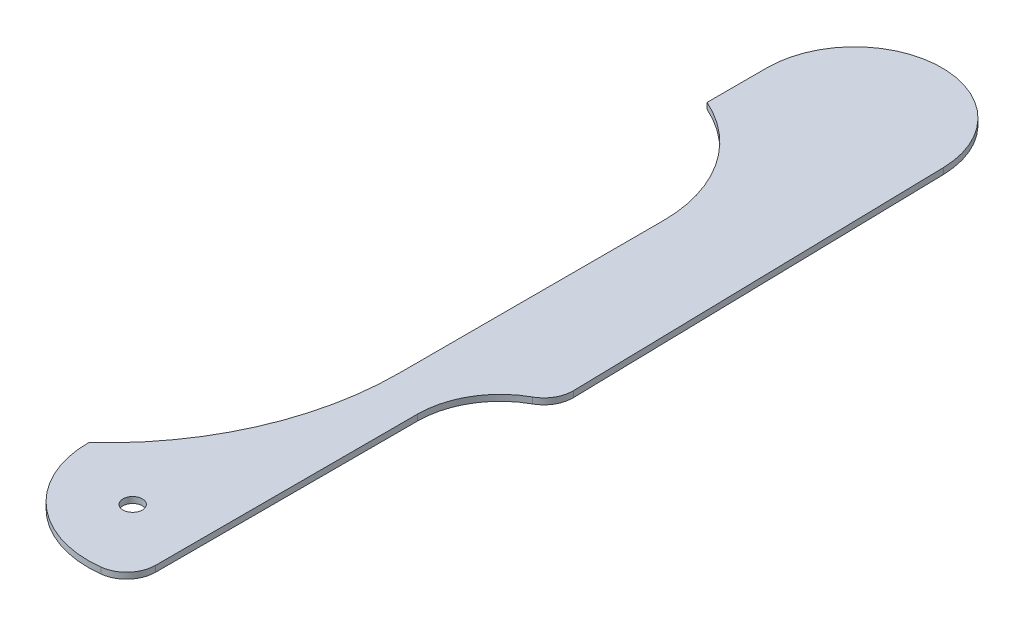
ISO-10303-21;
HEADER;
FILE_DESCRIPTION(('STEP AP214'),'2;1');
FILE_NAME('part.step','',(''),(''),'','','');
FILE_SCHEMA(('AUTOMOTIVE_DESIGN { 1 0 10303 214 1 1 1 1 }'));
ENDSEC;
DATA;
#1=APPLICATION_CONTEXT('core data for automotive mechanical design processes');
#2=APPLICATION_PROTOCOL_DEFINITION('international standard','automotive_design',2000,#1);
#3=PRODUCT_CONTEXT('',#1,'mechanical');
#4=PRODUCT('Part','Part','',(#3));
#5=PRODUCT_RELATED_PRODUCT_CATEGORY('part','',(#4));
#6=PRODUCT_DEFINITION_FORMATION('','',#4);
#7=PRODUCT_DEFINITION_CONTEXT('part definition',#1,'design');
#8=PRODUCT_DEFINITION('design','',#6,#7);
#9=PRODUCT_DEFINITION_SHAPE('','',#8);
#10=(LENGTH_UNIT() NAMED_UNIT(*) SI_UNIT(.MILLI.,.METRE.));
#11=(NAMED_UNIT(*) PLANE_ANGLE_UNIT() SI_UNIT($,.RADIAN.));
#12=(NAMED_UNIT(*) SI_UNIT($,.STERADIAN.) SOLID_ANGLE_UNIT());
#13=UNCERTAINTY_MEASURE_WITH_UNIT(LENGTH_MEASURE(1.E-05),#10,'distance_accuracy_value','');
#14=(GEOMETRIC_REPRESENTATION_CONTEXT(3) GLOBAL_UNCERTAINTY_ASSIGNED_CONTEXT((#13)) GLOBAL_UNIT_ASSIGNED_CONTEXT((#10,
#11,#12)) REPRESENTATION_CONTEXT('',''));
#15=CARTESIAN_POINT('',(0.,0.,0.));
#16=DIRECTION('',(0.,0.,1.));
#17=DIRECTION('',(1.,0.,0.));
#18=AXIS2_PLACEMENT_3D('',#15,#16,#17);
#19=CARTESIAN_POINT('',(0.503341369163434,0.5,12.2781082761111));
#20=DIRECTION('',(0.,-1.,0.));
#21=DIRECTION('',(0.,0.,-1.));
#22=AXIS2_PLACEMENT_3D('',#19,#20,#21);
#23=CYLINDRICAL_SURFACE('',#22,5.4);
#24=CARTESIAN_POINT('',(0.503341369163434,0.125,12.2781082761111));
#25=DIRECTION('',(0.,1.,0.));
#26=DIRECTION('',(0.,0.,-1.));
#27=AXIS2_PLACEMENT_3D('',#24,#25,#26);
#28=CIRCLE('',#27,5.4);
#29=CARTESIAN_POINT('',(5.90205631539494,0.125,12.1603078969244));
#30=VERTEX_POINT('',#29);
#31=CARTESIAN_POINT('',(-4.89665863083657,0.125,12.2781082761111));
#32=VERTEX_POINT('',#31);
#33=EDGE_CURVE('E154',#30,#32,#28,.T.);
#34=ORIENTED_EDGE('',*,*,#33,.T.);
#35=DIRECTION('',(0.,-1.,0.));
#36=VECTOR('',#35,1.);
#37=CARTESIAN_POINT('',(-4.89665863083657,0.5,12.2781082761111));
#38=LINE('',#37,#36);
#39=CARTESIAN_POINT('',(-4.89665863083657,0.5,12.2781082761111));
#40=VERTEX_POINT('',#39);
#41=EDGE_CURVE('E11',#40,#32,#38,.T.);
#42=ORIENTED_EDGE('',*,*,#41,.F.);
#43=CARTESIAN_POINT('',(0.503341369163434,0.5,12.2781082761111));
#44=DIRECTION('',(0.,1.,0.));
#45=DIRECTION('',(0.,0.,-1.));
#46=AXIS2_PLACEMENT_3D('',#43,#44,#45);
#47=CIRCLE('',#46,5.4);
#48=CARTESIAN_POINT('',(5.90205631539494,0.5,12.1603078969244));
#49=VERTEX_POINT('',#48);
#50=EDGE_CURVE('E174',#49,#40,#47,.T.);
#51=ORIENTED_EDGE('',*,*,#50,.F.);
#52=DIRECTION('',(0.,-1.,0.));
#53=VECTOR('',#52,1.);
#54=CARTESIAN_POINT('',(5.90205631539494,0.5,12.1603078969244));
#55=LINE('',#54,#53);
#56=EDGE_CURVE('E150',#49,#30,#55,.T.);
#57=ORIENTED_EDGE('',*,*,#56,.T.);
#58=EDGE_LOOP('',(#34,#42,#51,#57));
#59=FACE_BOUND('',#58,.T.);
#60=ADVANCED_FACE('F39',(#59),#23,.T.);
#61=CARTESIAN_POINT('',(-4.89665863083657,0.5,15.9981082761111));
#62=DIRECTION('',(1.,0.,0.));
#63=DIRECTION('',(0.,0.,-1.));
#64=AXIS2_PLACEMENT_3D('',#61,#62,#63);
#65=PLANE('',#64);
#66=DIRECTION('',(0.,0.,1.));
#67=VECTOR('',#66,1.);
#68=CARTESIAN_POINT('',(-4.89665863083657,0.125,15.9981082761111));
#69=LINE('',#68,#67);
#70=CARTESIAN_POINT('',(-4.89665863083657,0.125,15.9981082761111));
#71=VERTEX_POINT('',#70);
#72=EDGE_CURVE('E157',#32,#71,#69,.T.);
#73=ORIENTED_EDGE('',*,*,#72,.T.);
#74=DIRECTION('',(0.,-1.,0.));
#75=VECTOR('',#74,1.);
#76=CARTESIAN_POINT('',(-4.89665863083657,0.5,15.9981082761111));
#77=LINE('',#76,#75);
#78=CARTESIAN_POINT('',(-4.89665863083657,0.5,15.9981082761111));
#79=VERTEX_POINT('',#78);
#80=EDGE_CURVE('E48',#79,#71,#77,.T.);
#81=ORIENTED_EDGE('',*,*,#80,.F.);
#82=DIRECTION('',(0.,0.,1.));
#83=VECTOR('',#82,1.);
#84=CARTESIAN_POINT('',(-4.89665863083657,0.5,15.9981082761111));
#85=LINE('',#84,#83);
#86=EDGE_CURVE('E108',#40,#79,#85,.T.);
#87=ORIENTED_EDGE('',*,*,#86,.F.);
#88=ORIENTED_EDGE('',*,*,#41,.T.);
#89=EDGE_LOOP('',(#73,#81,#87,#88));
#90=FACE_BOUND('',#89,.T.);
#91=ADVANCED_FACE('F248',(#90),#65,.F.);
#92=CARTESIAN_POINT('',(-8.31665863083656,0.5,23.6703700026165));
#93=DIRECTION('',(0.,-1.,0.));
#94=DIRECTION('',(0.,0.,-1.));
#95=AXIS2_PLACEMENT_3D('',#92,#93,#94);
#96=CYLINDRICAL_SURFACE('',#95,8.4);
#97=CARTESIAN_POINT('',(-8.31665863083656,0.125,23.6703700026165));
#98=DIRECTION('',(0.,-1.,0.));
#99=DIRECTION('',(0.,0.,1.));
#100=AXIS2_PLACEMENT_3D('',#97,#98,#99);
#101=CIRCLE('',#100,8.4);
#102=CARTESIAN_POINT('',(0.0833413691634394,0.125,23.6703700026165));
#103=VERTEX_POINT('',#102);
#104=EDGE_CURVE('E159',#71,#103,#101,.T.);
#105=ORIENTED_EDGE('',*,*,#104,.T.);
#106=DIRECTION('',(0.,-1.,0.));
#107=VECTOR('',#106,1.);
#108=CARTESIAN_POINT('',(0.0833413691634394,0.5,23.6703700026165));
#109=LINE('',#108,#107);
#110=CARTESIAN_POINT('',(0.0833413691634394,0.5,23.6703700026165));
#111=VERTEX_POINT('',#110);
#112=EDGE_CURVE('E190',#111,#103,#109,.T.);
#113=ORIENTED_EDGE('',*,*,#112,.F.);
#114=CARTESIAN_POINT('',(-8.31665863083656,0.5,23.6703700026165));
#115=DIRECTION('',(0.,-1.,0.));
#116=DIRECTION('',(0.,0.,1.));
#117=AXIS2_PLACEMENT_3D('',#114,#115,#116);
#118=CIRCLE('',#117,8.4);
#119=EDGE_CURVE('E199',#79,#111,#118,.T.);
#120=ORIENTED_EDGE('',*,*,#119,.F.);
#121=ORIENTED_EDGE('',*,*,#80,.T.);
#122=EDGE_LOOP('',(#105,#113,#120,#121));
#123=FACE_BOUND('',#122,.T.);
#124=ADVANCED_FACE('F197',(#123),#96,.F.);
#125=CARTESIAN_POINT('',(0.0833413691634395,0.5,40.0203700026165));
#126=DIRECTION('',(1.,0.,0.));
#127=DIRECTION('',(0.,0.,-1.));
#128=AXIS2_PLACEMENT_3D('',#125,#126,#127);
#129=PLANE('',#128);
#130=DIRECTION('',(0.,0.,1.));
#131=VECTOR('',#130,1.);
#132=CARTESIAN_POINT('',(0.0833413691634395,0.125,40.0203700026165));
#133=LINE('',#132,#131);
#134=CARTESIAN_POINT('',(0.0833413691634395,0.125,40.0203700026165));
#135=VERTEX_POINT('',#134);
#136=EDGE_CURVE('E161',#103,#135,#133,.T.);
#137=ORIENTED_EDGE('',*,*,#136,.T.);
#138=DIRECTION('',(0.,-1.,0.));
#139=VECTOR('',#138,1.);
#140=CARTESIAN_POINT('',(0.0833413691634395,0.5,40.0203700026165));
#141=LINE('',#140,#139);
#142=CARTESIAN_POINT('',(0.0833413691634395,0.5,40.0203700026165));
#143=VERTEX_POINT('',#142);
#144=EDGE_CURVE('E187',#143,#135,#141,.T.);
#145=ORIENTED_EDGE('',*,*,#144,.F.);
#146=DIRECTION('',(0.,0.,1.));
#147=VECTOR('',#146,1.);
#148=CARTESIAN_POINT('',(0.0833413691634395,0.5,40.0203700026165));
#149=LINE('',#148,#147);
#150=EDGE_CURVE('E217',#111,#143,#149,.T.);
#151=ORIENTED_EDGE('',*,*,#150,.F.);
#152=ORIENTED_EDGE('',*,*,#112,.T.);
#153=EDGE_LOOP('',(#137,#145,#151,#152));
#154=FACE_BOUND('',#153,.T.);
#155=ADVANCED_FACE('F208',(#154),#129,.F.);
#156=CARTESIAN_POINT('',(-17.9166586308366,0.5,40.0203700026165));
#157=DIRECTION('',(0.,-1.,0.));
#158=DIRECTION('',(0.,0.,-1.));
#159=AXIS2_PLACEMENT_3D('',#156,#157,#158);
#160=CYLINDRICAL_SURFACE('',#159,18.);
#161=CARTESIAN_POINT('',(-17.9166586308366,0.125,40.0203700026165));
#162=DIRECTION('',(0.,-1.,0.));
#163=DIRECTION('',(0.,0.,1.));
#164=AXIS2_PLACEMENT_3D('',#161,#162,#163);
#165=CIRCLE('',#164,18.);
#166=CARTESIAN_POINT('',(-5.79648405405819,0.125,53.3283138042868));
#167=VERTEX_POINT('',#166);
#168=EDGE_CURVE('E163',#135,#167,#165,.T.);
#169=ORIENTED_EDGE('',*,*,#168,.T.);
#170=DIRECTION('',(0.,-1.,0.));
#171=VECTOR('',#170,1.);
#172=CARTESIAN_POINT('',(-5.79648405405819,0.5,53.3283138042868));
#173=LINE('',#172,#171);
#174=CARTESIAN_POINT('',(-5.79648405405819,0.5,53.3283138042868));
#175=VERTEX_POINT('',#174);
#176=EDGE_CURVE('E184',#175,#167,#173,.T.);
#177=ORIENTED_EDGE('',*,*,#176,.F.);
#178=CARTESIAN_POINT('',(-17.9166586308366,0.5,40.0203700026165));
#179=DIRECTION('',(0.,-1.,0.));
#180=DIRECTION('',(0.,0.,1.));
#181=AXIS2_PLACEMENT_3D('',#178,#179,#180);
#182=CIRCLE('',#181,18.);
#183=EDGE_CURVE('E214',#143,#175,#182,.T.);
#184=ORIENTED_EDGE('',*,*,#183,.F.);
#185=ORIENTED_EDGE('',*,*,#144,.T.);
#186=EDGE_LOOP('',(#169,#177,#184,#185));
#187=FACE_BOUND('',#186,.T.);
#188=ADVANCED_FACE('F212',(#187),#160,.F.);
#189=CARTESIAN_POINT('',(0.503341369163441,0.5,53.3752140913901));
#190=DIRECTION('',(0.,-1.,0.));
#191=DIRECTION('',(0.,0.,-1.));
#192=AXIS2_PLACEMENT_3D('',#189,#190,#191);
#193=CYLINDRICAL_SURFACE('',#192,6.3);
#194=CARTESIAN_POINT('',(0.503341369163441,0.125,53.3752140913901));
#195=DIRECTION('',(0.,1.,0.));
#196=DIRECTION('',(0.,0.,-1.));
#197=AXIS2_PLACEMENT_3D('',#194,#195,#196);
#198=CIRCLE('',#197,6.3);
#199=CARTESIAN_POINT('',(1.25934136916344,0.125,59.6296896089695));
#200=VERTEX_POINT('',#199);
#201=EDGE_CURVE('E165',#167,#200,#198,.T.);
#202=ORIENTED_EDGE('',*,*,#201,.T.);
#203=DIRECTION('',(0.,-1.,0.));
#204=VECTOR('',#203,1.);
#205=CARTESIAN_POINT('',(1.25934136916344,0.5,59.6296896089695));
#206=LINE('',#205,#204);
#207=CARTESIAN_POINT('',(1.25934136916344,0.5,59.6296896089695));
#208=VERTEX_POINT('',#207);
#209=EDGE_CURVE('E181',#208,#200,#206,.T.);
#210=ORIENTED_EDGE('',*,*,#209,.F.);
#211=CARTESIAN_POINT('',(0.503341369163441,0.5,53.3752140913901));
#212=DIRECTION('',(0.,1.,0.));
#213=DIRECTION('',(0.,0.,-1.));
#214=AXIS2_PLACEMENT_3D('',#211,#212,#213);
#215=CIRCLE('',#214,6.3);
#216=EDGE_CURVE('E216',#175,#208,#215,.T.);
#217=ORIENTED_EDGE('',*,*,#216,.F.);
#218=ORIENTED_EDGE('',*,*,#176,.T.);
#219=EDGE_LOOP('',(#202,#210,#217,#218));
#220=FACE_BOUND('',#219,.T.);
#221=ADVANCED_FACE('F261',(#220),#193,.T.);
#222=CARTESIAN_POINT('',(1.04334136916344,0.5,57.8426966039468));
#223=DIRECTION('',(0.,-1.,0.));
#224=DIRECTION('',(0.,0.,-1.));
#225=AXIS2_PLACEMENT_3D('',#222,#223,#224);
#226=CYLINDRICAL_SURFACE('',#225,1.80000000000001);
#227=CARTESIAN_POINT('',(1.04334136916344,0.125,57.8426966039468));
#228=DIRECTION('',(0.,1.,0.));
#229=DIRECTION('',(0.,0.,-1.));
#230=AXIS2_PLACEMENT_3D('',#227,#228,#229);
#231=CIRCLE('',#230,1.80000000000001);
#232=CARTESIAN_POINT('',(2.84334136916345,0.125,57.8426966039468));
#233=VERTEX_POINT('',#232);
#234=EDGE_CURVE('E167',#200,#233,#231,.T.);
#235=ORIENTED_EDGE('',*,*,#234,.T.);
#236=DIRECTION('',(0.,-1.,0.));
#237=VECTOR('',#236,1.);
#238=CARTESIAN_POINT('',(2.84334136916345,0.5,57.8426966039468));
#239=LINE('',#238,#237);
#240=CARTESIAN_POINT('',(2.84334136916345,0.5,57.8426966039468));
#241=VERTEX_POINT('',#240);
#242=EDGE_CURVE('E178',#241,#233,#239,.T.);
#243=ORIENTED_EDGE('',*,*,#242,.F.);
#244=CARTESIAN_POINT('',(1.04334136916344,0.5,57.8426966039468));
#245=DIRECTION('',(0.,1.,0.));
#246=DIRECTION('',(0.,0.,-1.));
#247=AXIS2_PLACEMENT_3D('',#244,#245,#246);
#248=CIRCLE('',#247,1.80000000000001);
#249=EDGE_CURVE('E219',#208,#241,#248,.T.);
#250=ORIENTED_EDGE('',*,*,#249,.F.);
#251=ORIENTED_EDGE('',*,*,#209,.T.);
#252=EDGE_LOOP('',(#235,#243,#250,#251));
#253=FACE_BOUND('',#252,.T.);
#254=ADVANCED_FACE('F228',(#253),#226,.T.);
#255=CARTESIAN_POINT('',(2.84334136916344,0.5,41.6426966039469));
#256=DIRECTION('',(-1.,0.,0.));
#257=DIRECTION('',(0.,0.,1.));
#258=AXIS2_PLACEMENT_3D('',#255,#256,#257);
#259=PLANE('',#258);
#260=DIRECTION('',(0.,0.,-1.));
#261=VECTOR('',#260,1.);
#262=CARTESIAN_POINT('',(2.84334136916344,0.125,41.6426966039469));
#263=LINE('',#262,#261);
#264=CARTESIAN_POINT('',(2.84334136916344,0.125,41.6426966039469));
#265=VERTEX_POINT('',#264);
#266=EDGE_CURVE('E169',#233,#265,#263,.T.);
#267=ORIENTED_EDGE('',*,*,#266,.T.);
#268=DIRECTION('',(0.,-1.,0.));
#269=VECTOR('',#268,1.);
#270=CARTESIAN_POINT('',(2.84334136916344,0.5,41.6426966039469));
#271=LINE('',#270,#269);
#272=CARTESIAN_POINT('',(2.84334136916344,0.5,41.6426966039469));
#273=VERTEX_POINT('',#272);
#274=EDGE_CURVE('E145',#273,#265,#271,.T.);
#275=ORIENTED_EDGE('',*,*,#274,.F.);
#276=DIRECTION('',(0.,0.,-1.));
#277=VECTOR('',#276,1.);
#278=CARTESIAN_POINT('',(2.84334136916344,0.5,41.6426966039469));
#279=LINE('',#278,#277);
#280=EDGE_CURVE('E136',#241,#273,#279,.T.);
#281=ORIENTED_EDGE('',*,*,#280,.F.);
#282=ORIENTED_EDGE('',*,*,#242,.T.);
#283=EDGE_LOOP('',(#267,#275,#281,#282));
#284=FACE_BOUND('',#283,.T.);
#285=ADVANCED_FACE('F232',(#284),#259,.F.);
#286=CARTESIAN_POINT('',(7.94334136916344,0.5,41.6426966039469));
#287=DIRECTION('',(0.,-1.,0.));
#288=DIRECTION('',(0.,0.,-1.));
#289=AXIS2_PLACEMENT_3D('',#286,#287,#288);
#290=CYLINDRICAL_SURFACE('',#289,5.1);
#291=CARTESIAN_POINT('',(7.94334136916344,0.125,41.6426966039469));
#292=DIRECTION('',(0.,-1.,0.));
#293=DIRECTION('',(0.,0.,1.));
#294=AXIS2_PLACEMENT_3D('',#291,#292,#293);
#295=CIRCLE('',#294,5.1);
#296=CARTESIAN_POINT('',(5.4818397576583,0.125,37.1760412762371));
#297=VERTEX_POINT('',#296);
#298=EDGE_CURVE('E144',#265,#297,#295,.T.);
#299=ORIENTED_EDGE('',*,*,#298,.T.);
#300=DIRECTION('',(0.,-1.,0.));
#301=VECTOR('',#300,1.);
#302=CARTESIAN_POINT('',(5.4818397576583,0.5,37.1760412762371));
#303=LINE('',#302,#301);
#304=CARTESIAN_POINT('',(5.4818397576583,0.5,37.1760412762371));
#305=VERTEX_POINT('',#304);
#306=EDGE_CURVE('E141',#305,#297,#303,.T.);
#307=ORIENTED_EDGE('',*,*,#306,.F.);
#308=CARTESIAN_POINT('',(7.94334136916344,0.5,41.6426966039469));
#309=DIRECTION('',(0.,-1.,0.));
#310=DIRECTION('',(0.,0.,1.));
#311=AXIS2_PLACEMENT_3D('',#308,#309,#310);
#312=CIRCLE('',#311,5.1);
#313=EDGE_CURVE('E130',#273,#305,#312,.T.);
#314=ORIENTED_EDGE('',*,*,#313,.F.);
#315=ORIENTED_EDGE('',*,*,#274,.T.);
#316=EDGE_LOOP('',(#299,#307,#314,#315));
#317=FACE_BOUND('',#316,.T.);
#318=ADVANCED_FACE('F142',(#317),#290,.F.);
#319=CARTESIAN_POINT('',(4.61307448300942,0.5,35.5995746899866));
#320=DIRECTION('',(0.,-1.,0.));
#321=DIRECTION('',(0.,0.,-1.));
#322=AXIS2_PLACEMENT_3D('',#319,#320,#321);
#323=CYLINDRICAL_SURFACE('',#322,1.8);
#324=CARTESIAN_POINT('',(4.61307448300942,0.125,35.5995746899866));
#325=DIRECTION('',(0.,1.,0.));
#326=DIRECTION('',(0.,0.,-1.));
#327=AXIS2_PLACEMENT_3D('',#324,#325,#326);
#328=CIRCLE('',#327,1.8);
#329=CARTESIAN_POINT('',(6.41264613175326,0.125,35.5603078969244));
#330=VERTEX_POINT('',#329);
#331=EDGE_CURVE('E94',#297,#330,#328,.T.);
#332=ORIENTED_EDGE('',*,*,#331,.T.);
#333=DIRECTION('',(0.,-1.,0.));
#334=VECTOR('',#333,1.);
#335=CARTESIAN_POINT('',(6.41264613175326,0.5,35.5603078969244));
#336=LINE('',#335,#334);
#337=CARTESIAN_POINT('',(6.41264613175326,0.5,35.5603078969244));
#338=VERTEX_POINT('',#337);
#339=EDGE_CURVE('E146',#338,#330,#336,.T.);
#340=ORIENTED_EDGE('',*,*,#339,.F.);
#341=CARTESIAN_POINT('',(4.61307448300942,0.5,35.5995746899866));
#342=DIRECTION('',(0.,1.,0.));
#343=DIRECTION('',(0.,0.,-1.));
#344=AXIS2_PLACEMENT_3D('',#341,#342,#343);
#345=CIRCLE('',#344,1.8);
#346=EDGE_CURVE('E134',#305,#338,#345,.T.);
#347=ORIENTED_EDGE('',*,*,#346,.F.);
#348=ORIENTED_EDGE('',*,*,#306,.T.);
#349=EDGE_LOOP('',(#332,#340,#347,#348));
#350=FACE_BOUND('',#349,.T.);
#351=ADVANCED_FACE('F148',(#350),#323,.T.);
#352=CARTESIAN_POINT('',(5.90205631539494,0.5,12.1603078969244));
#353=DIRECTION('',(-0.999762027079909,0.,0.0218148850345619));
#354=DIRECTION('',(0.0218148850345619,0.,0.999762027079909));
#355=AXIS2_PLACEMENT_3D('',#352,#353,#354);
#356=PLANE('',#355);
#357=DIRECTION('',(-0.0218148850345619,0.,-0.999762027079909));
#358=VECTOR('',#357,1.);
#359=CARTESIAN_POINT('',(5.90205631539494,0.125,12.1603078969244));
#360=LINE('',#359,#358);
#361=EDGE_CURVE('E100',#330,#30,#360,.T.);
#362=ORIENTED_EDGE('',*,*,#361,.T.);
#363=ORIENTED_EDGE('',*,*,#56,.F.);
#364=DIRECTION('',(-0.0218148850345619,0.,-0.999762027079909));
#365=VECTOR('',#364,1.);
#366=CARTESIAN_POINT('',(5.90205631539494,0.5,12.1603078969244));
#367=LINE('',#366,#365);
#368=EDGE_CURVE('E56',#338,#49,#367,.T.);
#369=ORIENTED_EDGE('',*,*,#368,.F.);
#370=ORIENTED_EDGE('',*,*,#339,.T.);
#371=EDGE_LOOP('',(#362,#363,#369,#370));
#372=FACE_BOUND('',#371,.T.);
#373=ADVANCED_FACE('F236',(#372),#356,.F.);
#374=CARTESIAN_POINT('',(0.503341369163434,0.5,12.2781082761111));
#375=DIRECTION('',(0.,-1.,0.));
#376=DIRECTION('',(0.,0.,-1.));
#377=AXIS2_PLACEMENT_3D('',#374,#375,#376);
#378=PLANE('',#377);
#379=CARTESIAN_POINT('',(-1.12647108249804,0.5,55.2952140913901));
#380=DIRECTION('',(0.,1.,0.));
#381=DIRECTION('',(0.,0.,1.));
#382=AXIS2_PLACEMENT_3D('',#379,#380,#381);
#383=CIRCLE('',#382,0.6);
#384=CARTESIAN_POINT('',(-1.12647108249804,0.5,55.8952140913901));
#385=VERTEX_POINT('',#384);
#386=EDGE_CURVE('E387',#385,#385,#383,.T.);
#387=ORIENTED_EDGE('',*,*,#386,.F.);
#388=EDGE_LOOP('',(#387));
#389=FACE_BOUND('',#388,.T.);
#390=ORIENTED_EDGE('',*,*,#50,.T.);
#391=ORIENTED_EDGE('',*,*,#86,.T.);
#392=ORIENTED_EDGE('',*,*,#119,.T.);
#393=ORIENTED_EDGE('',*,*,#150,.T.);
#394=ORIENTED_EDGE('',*,*,#183,.T.);
#395=ORIENTED_EDGE('',*,*,#216,.T.);
#396=ORIENTED_EDGE('',*,*,#249,.T.);
#397=ORIENTED_EDGE('',*,*,#280,.T.);
#398=ORIENTED_EDGE('',*,*,#313,.T.);
#399=ORIENTED_EDGE('',*,*,#346,.T.);
#400=ORIENTED_EDGE('',*,*,#368,.T.);
#401=EDGE_LOOP('',(#390,#391,#392,#393,#394,#395,#396,#397,#398,#399,#400));
#402=FACE_BOUND('',#401,.T.);
#403=ADVANCED_FACE('F132',(#389,#402),#378,.F.);
#404=CARTESIAN_POINT('',(0.503341369163434,0.125,12.2781082761111));
#405=DIRECTION('',(0.,-1.,0.));
#406=DIRECTION('',(0.,0.,-1.));
#407=AXIS2_PLACEMENT_3D('',#404,#405,#406);
#408=PLANE('',#407);
#409=CARTESIAN_POINT('',(-1.12647108249804,0.125,55.2952140913901));
#410=DIRECTION('',(0.,-1.,0.));
#411=DIRECTION('',(0.,0.,-1.));
#412=AXIS2_PLACEMENT_3D('',#409,#410,#411);
#413=CIRCLE('',#412,0.6);
#414=CARTESIAN_POINT('',(-1.12647108249804,0.125,54.6952140913901));
#415=VERTEX_POINT('',#414);
#416=EDGE_CURVE('E42',#415,#415,#413,.T.);
#417=ORIENTED_EDGE('',*,*,#416,.F.);
#418=EDGE_LOOP('',(#417));
#419=FACE_BOUND('',#418,.T.);
#420=ORIENTED_EDGE('',*,*,#33,.F.);
#421=ORIENTED_EDGE('',*,*,#361,.F.);
#422=ORIENTED_EDGE('',*,*,#331,.F.);
#423=ORIENTED_EDGE('',*,*,#298,.F.);
#424=ORIENTED_EDGE('',*,*,#266,.F.);
#425=ORIENTED_EDGE('',*,*,#234,.F.);
#426=ORIENTED_EDGE('',*,*,#201,.F.);
#427=ORIENTED_EDGE('',*,*,#168,.F.);
#428=ORIENTED_EDGE('',*,*,#136,.F.);
#429=ORIENTED_EDGE('',*,*,#104,.F.);
#430=ORIENTED_EDGE('',*,*,#72,.F.);
#431=EDGE_LOOP('',(#420,#421,#422,#423,#424,#425,#426,#427,#428,#429,#430));
#432=FACE_BOUND('',#431,.T.);
#433=ADVANCED_FACE('F203',(#419,#432),#408,.T.);
#434=CARTESIAN_POINT('',(-1.12647108249804,-0.7,55.2952140913901));
#435=DIRECTION('',(0.,1.,0.));
#436=DIRECTION('',(0.,0.,1.));
#437=AXIS2_PLACEMENT_3D('',#434,#435,#436);
#438=CYLINDRICAL_SURFACE('',#437,0.6);
#439=ORIENTED_EDGE('',*,*,#416,.T.);
#440=EDGE_LOOP('',(#439));
#441=FACE_BOUND('',#440,.T.);
#442=ORIENTED_EDGE('',*,*,#386,.T.);
#443=EDGE_LOOP('',(#442));
#444=FACE_BOUND('',#443,.T.);
#445=ADVANCED_FACE('F300',(#441,#444),#438,.F.);
#446=CLOSED_SHELL('',(#60,#91,#124,#155,#188,#221,#254,#285,#318,#351,#373,#403,#433,#445));
#447=MANIFOLD_SOLID_BREP('B2',#446);
#448=ADVANCED_BREP_SHAPE_REPRESENTATION('',(#18,#447),#14);
#449=SHAPE_DEFINITION_REPRESENTATION(#9,#448);
ENDSEC;
END-ISO-10303-21;
